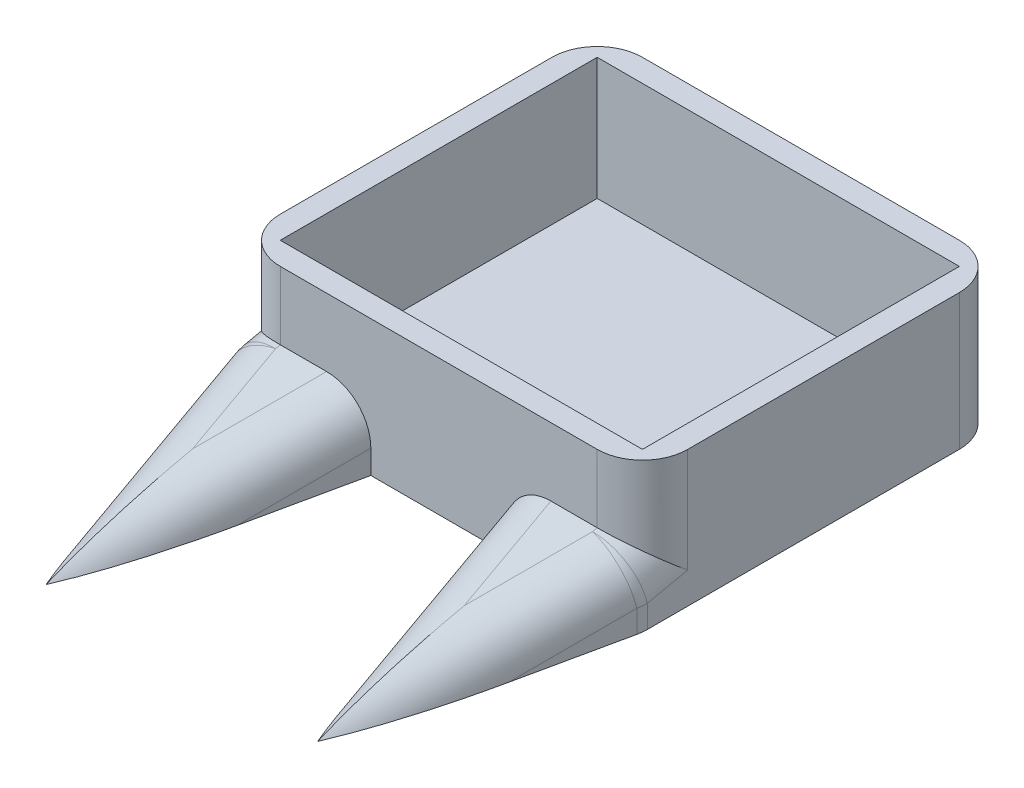
ISO-10303-21;
HEADER;
FILE_DESCRIPTION(('STEP AP214'),'2;1');
FILE_NAME('part.step','',(''),(''),'','','');
FILE_SCHEMA(('AUTOMOTIVE_DESIGN { 1 0 10303 214 1 1 1 1 }'));
ENDSEC;
DATA;
#1=APPLICATION_CONTEXT('core data for automotive mechanical design processes');
#2=APPLICATION_PROTOCOL_DEFINITION('international standard','automotive_design',2000,#1);
#3=PRODUCT_CONTEXT('',#1,'mechanical');
#4=PRODUCT('Part','Part','',(#3));
#5=PRODUCT_RELATED_PRODUCT_CATEGORY('part','',(#4));
#6=PRODUCT_DEFINITION_FORMATION('','',#4);
#7=PRODUCT_DEFINITION_CONTEXT('part definition',#1,'design');
#8=PRODUCT_DEFINITION('design','',#6,#7);
#9=PRODUCT_DEFINITION_SHAPE('','',#8);
#10=(LENGTH_UNIT() NAMED_UNIT(*) SI_UNIT(.MILLI.,.METRE.));
#11=(NAMED_UNIT(*) PLANE_ANGLE_UNIT() SI_UNIT($,.RADIAN.));
#12=(NAMED_UNIT(*) SI_UNIT($,.STERADIAN.) SOLID_ANGLE_UNIT());
#13=UNCERTAINTY_MEASURE_WITH_UNIT(LENGTH_MEASURE(1.E-05),#10,'distance_accuracy_value','');
#14=(GEOMETRIC_REPRESENTATION_CONTEXT(3) GLOBAL_UNCERTAINTY_ASSIGNED_CONTEXT((#13)) GLOBAL_UNIT_ASSIGNED_CONTEXT((#10,
#11,#12)) REPRESENTATION_CONTEXT('',''));
#15=CARTESIAN_POINT('',(0.,0.,0.));
#16=DIRECTION('',(0.,0.,1.));
#17=DIRECTION('',(1.,0.,0.));
#18=AXIS2_PLACEMENT_3D('',#15,#16,#17);
#19=CARTESIAN_POINT('',(0.,30.,0.));
#20=DIRECTION('',(0.,1.,0.));
#21=DIRECTION('',(0.,0.,1.));
#22=AXIS2_PLACEMENT_3D('',#19,#20,#21);
#23=PLANE('',#22);
#24=DIRECTION('',(0.,0.,-1.));
#25=VECTOR('',#24,1.);
#26=CARTESIAN_POINT('',(40.,30.,-35.));
#27=LINE('',#26,#25);
#28=CARTESIAN_POINT('',(40.,30.,35.));
#29=VERTEX_POINT('',#28);
#30=CARTESIAN_POINT('',(40.,30.,-35.));
#31=VERTEX_POINT('',#30);
#32=EDGE_CURVE('E237',#29,#31,#27,.T.);
#33=ORIENTED_EDGE('',*,*,#32,.F.);
#34=DIRECTION('',(1.,0.,0.));
#35=VECTOR('',#34,1.);
#36=CARTESIAN_POINT('',(-40.,30.,35.));
#37=LINE('',#36,#35);
#38=CARTESIAN_POINT('',(-40.,30.,35.));
#39=VERTEX_POINT('',#38);
#40=EDGE_CURVE('E251',#39,#29,#37,.T.);
#41=ORIENTED_EDGE('',*,*,#40,.F.);
#42=DIRECTION('',(0.,0.,1.));
#43=VECTOR('',#42,1.);
#44=CARTESIAN_POINT('',(-40.,30.,-35.));
#45=LINE('',#44,#43);
#46=CARTESIAN_POINT('',(-40.,30.,-35.));
#47=VERTEX_POINT('',#46);
#48=EDGE_CURVE('E258',#47,#39,#45,.T.);
#49=ORIENTED_EDGE('',*,*,#48,.F.);
#50=DIRECTION('',(-1.,0.,0.));
#51=VECTOR('',#50,1.);
#52=CARTESIAN_POINT('',(-40.,30.,-35.));
#53=LINE('',#52,#51);
#54=EDGE_CURVE('E265',#31,#47,#53,.T.);
#55=ORIENTED_EDGE('',*,*,#54,.F.);
#56=EDGE_LOOP('',(#33,#41,#49,#55));
#57=FACE_BOUND('',#56,.T.);
#58=DIRECTION('',(0.,0.,-1.));
#59=VECTOR('',#58,1.);
#60=CARTESIAN_POINT('',(-45.,30.,40.));
#61=LINE('',#60,#59);
#62=CARTESIAN_POINT('',(-45.,30.,30.));
#63=VERTEX_POINT('',#62);
#64=CARTESIAN_POINT('',(-45.,30.,-30.));
#65=VERTEX_POINT('',#64);
#66=EDGE_CURVE('E292',#63,#65,#61,.T.);
#67=ORIENTED_EDGE('',*,*,#66,.F.);
#68=CARTESIAN_POINT('',(-35.,30.,30.));
#69=DIRECTION('',(0.,1.,0.));
#70=DIRECTION('',(0.,0.,1.));
#71=AXIS2_PLACEMENT_3D('',#68,#69,#70);
#72=CIRCLE('',#71,10.);
#73=CARTESIAN_POINT('',(-35.,30.,40.));
#74=VERTEX_POINT('',#73);
#75=EDGE_CURVE('E400',#63,#74,#72,.T.);
#76=ORIENTED_EDGE('',*,*,#75,.T.);
#77=DIRECTION('',(1.,0.,0.));
#78=VECTOR('',#77,1.);
#79=CARTESIAN_POINT('',(-45.,30.,40.));
#80=LINE('',#79,#78);
#81=CARTESIAN_POINT('',(35.,30.,40.));
#82=VERTEX_POINT('',#81);
#83=EDGE_CURVE('E296',#74,#82,#80,.T.);
#84=ORIENTED_EDGE('',*,*,#83,.T.);
#85=CARTESIAN_POINT('',(35.,30.,30.));
#86=DIRECTION('',(0.,1.,0.));
#87=DIRECTION('',(0.,0.,1.));
#88=AXIS2_PLACEMENT_3D('',#85,#86,#87);
#89=CIRCLE('',#88,10.);
#90=CARTESIAN_POINT('',(45.,30.,30.));
#91=VERTEX_POINT('',#90);
#92=EDGE_CURVE('E399',#82,#91,#89,.T.);
#93=ORIENTED_EDGE('',*,*,#92,.T.);
#94=DIRECTION('',(0.,0.,-1.));
#95=VECTOR('',#94,1.);
#96=CARTESIAN_POINT('',(45.,30.,40.));
#97=LINE('',#96,#95);
#98=CARTESIAN_POINT('',(45.,30.,-30.));
#99=VERTEX_POINT('',#98);
#100=EDGE_CURVE('E300',#91,#99,#97,.T.);
#101=ORIENTED_EDGE('',*,*,#100,.T.);
#102=CARTESIAN_POINT('',(35.,30.,-30.));
#103=DIRECTION('',(0.,1.,0.));
#104=DIRECTION('',(0.,0.,1.));
#105=AXIS2_PLACEMENT_3D('',#102,#103,#104);
#106=CIRCLE('',#105,10.);
#107=CARTESIAN_POINT('',(35.,30.,-40.));
#108=VERTEX_POINT('',#107);
#109=EDGE_CURVE('E84',#99,#108,#106,.T.);
#110=ORIENTED_EDGE('',*,*,#109,.T.);
#111=DIRECTION('',(1.,0.,0.));
#112=VECTOR('',#111,1.);
#113=CARTESIAN_POINT('',(-45.,30.,-40.));
#114=LINE('',#113,#112);
#115=CARTESIAN_POINT('',(-35.,30.,-40.));
#116=VERTEX_POINT('',#115);
#117=EDGE_CURVE('E293',#116,#108,#114,.T.);
#118=ORIENTED_EDGE('',*,*,#117,.F.);
#119=CARTESIAN_POINT('',(-35.,30.,-30.));
#120=DIRECTION('',(0.,1.,0.));
#121=DIRECTION('',(0.,0.,1.));
#122=AXIS2_PLACEMENT_3D('',#119,#120,#121);
#123=CIRCLE('',#122,10.);
#124=EDGE_CURVE('E396',#116,#65,#123,.T.);
#125=ORIENTED_EDGE('',*,*,#124,.T.);
#126=EDGE_LOOP('',(#67,#76,#84,#93,#101,#110,#118,#125));
#127=FACE_BOUND('',#126,.T.);
#128=ADVANCED_FACE('F66',(#57,#127),#23,.T.);
#129=CARTESIAN_POINT('',(15.,30.,40.));
#130=DIRECTION('',(0.977802414077409,0.,-0.209529088730874));
#131=DIRECTION('',(-0.209529088730874,0.,-0.977802414077409));
#132=AXIS2_PLACEMENT_3D('',#129,#130,#131);
#133=PLANE('',#132);
#134=DIRECTION('',(0.209529088730874,0.,0.977802414077409));
#135=VECTOR('',#134,1.);
#136=CARTESIAN_POINT('',(15.,0.,40.));
#137=LINE('',#136,#135);
#138=CARTESIAN_POINT('',(15.,0.,40.));
#139=VERTEX_POINT('',#138);
#140=CARTESIAN_POINT('',(20.2219758592259,0.,64.3692206763876));
#141=VERTEX_POINT('',#140);
#142=EDGE_CURVE('E282',#139,#141,#137,.T.);
#143=ORIENTED_EDGE('',*,*,#142,.T.);
#144=DIRECTION('',(-0.2050757781074,0.205075778107399,-0.957020297834528));
#145=VECTOR('',#144,1.);
#146=CARTESIAN_POINT('',(13.957933564173,6.26404229505286,35.1370232994742));
#147=LINE('',#146,#145);
#148=CARTESIAN_POINT('',(15.,5.22197585922591,40.));
#149=VERTEX_POINT('',#148);
#150=EDGE_CURVE('E331',#141,#149,#147,.T.);
#151=ORIENTED_EDGE('',*,*,#150,.T.);
#152=DIRECTION('',(0.,-1.,0.));
#153=VECTOR('',#152,1.);
#154=CARTESIAN_POINT('',(15.,30.,40.));
#155=LINE('',#154,#153);
#156=EDGE_CURVE('E281',#149,#139,#155,.T.);
#157=ORIENTED_EDGE('',*,*,#156,.T.);
#158=EDGE_LOOP('',(#143,#151,#157));
#159=FACE_BOUND('',#158,.T.);
#160=ADVANCED_FACE('F516',(#159),#133,.F.);
#161=CARTESIAN_POINT('',(45.,30.,40.));
#162=DIRECTION('',(0.977802414077409,0.,0.209529088730873));
#163=DIRECTION('',(0.209529088730873,0.,-0.97780241407741));
#164=AXIS2_PLACEMENT_3D('',#161,#162,#163);
#165=PLANE('',#164);
#166=DIRECTION('',(-0.209529088730873,0.,0.97780241407741));
#167=VECTOR('',#166,1.);
#168=CARTESIAN_POINT('',(45.,0.,40.));
#169=LINE('',#168,#167);
#170=CARTESIAN_POINT('',(44.7780241407741,0.,41.0358873430542));
#171=VERTEX_POINT('',#170);
#172=CARTESIAN_POINT('',(39.7780241407741,0.,64.3692206763876));
#173=VERTEX_POINT('',#172);
#174=EDGE_CURVE('E279',#171,#173,#169,.T.);
#175=ORIENTED_EDGE('',*,*,#174,.F.);
#176=DIRECTION('',(0.,-1.,0.));
#177=VECTOR('',#176,1.);
#178=CARTESIAN_POINT('',(44.7780241407741,5.22197585922591,41.0358873430542));
#179=LINE('',#178,#177);
#180=CARTESIAN_POINT('',(44.7780241407741,5.00000000000001,41.0358873430542));
#181=VERTEX_POINT('',#180);
#182=EDGE_CURVE('E384',#171,#181,#179,.F.);
#183=ORIENTED_EDGE('',*,*,#182,.T.);
#184=DIRECTION('',(0.205075778107399,0.205075778107399,-0.957020297834529));
#185=VECTOR('',#184,1.);
#186=CARTESIAN_POINT('',(30.4112253143316,-9.36679882644248,108.080948533119));
#187=LINE('',#186,#185);
#188=EDGE_CURVE('E342',#181,#173,#187,.F.);
#189=ORIENTED_EDGE('',*,*,#188,.T.);
#190=EDGE_LOOP('',(#175,#183,#189));
#191=FACE_BOUND('',#190,.T.);
#192=ADVANCED_FACE('F514',(#191),#165,.T.);
#193=CARTESIAN_POINT('',(0.,0.,0.));
#194=DIRECTION('',(0.,1.,0.));
#195=DIRECTION('',(0.,0.,1.));
#196=AXIS2_PLACEMENT_3D('',#193,#194,#195);
#197=PLANE('',#196);
#198=DIRECTION('',(0.209529088730874,0.,0.97780241407741));
#199=VECTOR('',#198,1.);
#200=CARTESIAN_POINT('',(-45.,0.,40.));
#201=LINE('',#200,#199);
#202=CARTESIAN_POINT('',(-44.7780241407741,0.,41.0358873430542));
#203=VERTEX_POINT('',#202);
#204=CARTESIAN_POINT('',(-39.7780241407741,0.,64.3692206763876));
#205=VERTEX_POINT('',#204);
#206=EDGE_CURVE('E289',#203,#205,#201,.T.);
#207=ORIENTED_EDGE('',*,*,#206,.F.);
#208=CARTESIAN_POINT('',(-35.,0.,38.9405964557455));
#209=DIRECTION('',(0.,1.,0.));
#210=DIRECTION('',(0.,0.,1.));
#211=AXIS2_PLACEMENT_3D('',#208,#209,#210);
#212=CIRCLE('',#211,10.);
#213=CARTESIAN_POINT('',(-45.,0.,38.9405964557455));
#214=VERTEX_POINT('',#213);
#215=EDGE_CURVE('E364',#203,#214,#212,.F.);
#216=ORIENTED_EDGE('',*,*,#215,.T.);
#217=DIRECTION('',(0.,0.,-1.));
#218=VECTOR('',#217,1.);
#219=CARTESIAN_POINT('',(-45.,0.,40.));
#220=LINE('',#219,#218);
#221=CARTESIAN_POINT('',(-45.,0.,-30.));
#222=VERTEX_POINT('',#221);
#223=EDGE_CURVE('E298',#214,#222,#220,.T.);
#224=ORIENTED_EDGE('',*,*,#223,.T.);
#225=CARTESIAN_POINT('',(-35.,0.,-30.));
#226=DIRECTION('',(0.,1.,0.));
#227=DIRECTION('',(0.,0.,1.));
#228=AXIS2_PLACEMENT_3D('',#225,#226,#227);
#229=CIRCLE('',#228,10.);
#230=CARTESIAN_POINT('',(-35.,0.,-40.));
#231=VERTEX_POINT('',#230);
#232=EDGE_CURVE('E363',#222,#231,#229,.F.);
#233=ORIENTED_EDGE('',*,*,#232,.T.);
#234=DIRECTION('',(1.,0.,0.));
#235=VECTOR('',#234,1.);
#236=CARTESIAN_POINT('',(-45.,0.,-40.));
#237=LINE('',#236,#235);
#238=CARTESIAN_POINT('',(35.,0.,-40.));
#239=VERTEX_POINT('',#238);
#240=EDGE_CURVE('E305',#231,#239,#237,.T.);
#241=ORIENTED_EDGE('',*,*,#240,.T.);
#242=CARTESIAN_POINT('',(35.,0.,-30.));
#243=DIRECTION('',(0.,1.,0.));
#244=DIRECTION('',(0.,0.,1.));
#245=AXIS2_PLACEMENT_3D('',#242,#243,#244);
#246=CIRCLE('',#245,10.);
#247=CARTESIAN_POINT('',(45.,0.,-30.));
#248=VERTEX_POINT('',#247);
#249=EDGE_CURVE('E358',#239,#248,#246,.F.);
#250=ORIENTED_EDGE('',*,*,#249,.T.);
#251=DIRECTION('',(0.,0.,-1.));
#252=VECTOR('',#251,1.);
#253=CARTESIAN_POINT('',(45.,0.,40.));
#254=LINE('',#253,#252);
#255=CARTESIAN_POINT('',(45.,0.,38.9405964557455));
#256=VERTEX_POINT('',#255);
#257=EDGE_CURVE('E306',#256,#248,#254,.T.);
#258=ORIENTED_EDGE('',*,*,#257,.F.);
#259=CARTESIAN_POINT('',(35.,0.,38.9405964557455));
#260=DIRECTION('',(0.,1.,0.));
#261=DIRECTION('',(0.,0.,1.));
#262=AXIS2_PLACEMENT_3D('',#259,#260,#261);
#263=CIRCLE('',#262,10.);
#264=EDGE_CURVE('E361',#256,#171,#263,.F.);
#265=ORIENTED_EDGE('',*,*,#264,.T.);
#266=ORIENTED_EDGE('',*,*,#174,.T.);
#267=CARTESIAN_POINT('',(30.,0.,62.2739297890788));
#268=DIRECTION('',(0.,1.,0.));
#269=DIRECTION('',(-0.209529088730873,0.,0.97780241407741));
#270=AXIS2_PLACEMENT_3D('',#267,#268,#269);
#271=ELLIPSE('',#270,48.762462794426,10.);
#272=CARTESIAN_POINT('',(30.,0.,96.7541978983742));
#273=VERTEX_POINT('',#272);
#274=EDGE_CURVE('E323',#173,#273,#271,.F.);
#275=ORIENTED_EDGE('',*,*,#274,.T.);
#276=CARTESIAN_POINT('',(30.,0.,62.2739297890788));
#277=DIRECTION('',(0.,1.,0.));
#278=DIRECTION('',(-0.209529088730874,0.,-0.977802414077409));
#279=AXIS2_PLACEMENT_3D('',#276,#277,#278);
#280=ELLIPSE('',#279,48.762462794426,10.);
#281=EDGE_CURVE('E324',#273,#141,#280,.F.);
#282=ORIENTED_EDGE('',*,*,#281,.T.);
#283=ORIENTED_EDGE('',*,*,#142,.F.);
#284=DIRECTION('',(1.,0.,0.));
#285=VECTOR('',#284,1.);
#286=CARTESIAN_POINT('',(-45.,0.,40.));
#287=LINE('',#286,#285);
#288=CARTESIAN_POINT('',(-15.,0.,40.));
#289=VERTEX_POINT('',#288);
#290=EDGE_CURVE('E313',#289,#139,#287,.T.);
#291=ORIENTED_EDGE('',*,*,#290,.F.);
#292=DIRECTION('',(-0.209529088730874,0.,0.97780241407741));
#293=VECTOR('',#292,1.);
#294=CARTESIAN_POINT('',(-15.,0.,40.));
#295=LINE('',#294,#293);
#296=CARTESIAN_POINT('',(-20.2219758592259,0.,64.3692206763875));
#297=VERTEX_POINT('',#296);
#298=EDGE_CURVE('E290',#289,#297,#295,.T.);
#299=ORIENTED_EDGE('',*,*,#298,.T.);
#300=CARTESIAN_POINT('',(-30.,0.,62.2739297890788));
#301=DIRECTION('',(0.,1.,0.));
#302=DIRECTION('',(-0.209529088730874,0.,0.97780241407741));
#303=AXIS2_PLACEMENT_3D('',#300,#301,#302);
#304=ELLIPSE('',#303,48.762462794426,10.);
#305=CARTESIAN_POINT('',(-30.,0.,96.7541978983741));
#306=VERTEX_POINT('',#305);
#307=EDGE_CURVE('E330',#297,#306,#304,.F.);
#308=ORIENTED_EDGE('',*,*,#307,.T.);
#309=CARTESIAN_POINT('',(-30.,0.,62.2739297890788));
#310=DIRECTION('',(0.,1.,0.));
#311=DIRECTION('',(-0.209529088730874,0.,-0.977802414077409));
#312=AXIS2_PLACEMENT_3D('',#309,#310,#311);
#313=ELLIPSE('',#312,48.762462794426,10.);
#314=EDGE_CURVE('E328',#306,#205,#313,.F.);
#315=ORIENTED_EDGE('',*,*,#314,.T.);
#316=EDGE_LOOP('',(#207,#216,#224,#233,#241,#250,#258,#265,#266,#275,#282,#283,#291,#299,#308,#315));
#317=FACE_BOUND('',#316,.T.);
#318=ADVANCED_FACE('F455',(#317),#197,.F.);
#319=CARTESIAN_POINT('',(-45.,30.,40.));
#320=DIRECTION('',(0.97780241407741,0.,-0.209529088730874));
#321=DIRECTION('',(-0.209529088730874,0.,-0.97780241407741));
#322=AXIS2_PLACEMENT_3D('',#319,#320,#321);
#323=PLANE('',#322);
#324=DIRECTION('',(-0.205075778107399,0.205075778107399,-0.957020297834528));
#325=VECTOR('',#324,1.);
#326=CARTESIAN_POINT('',(-46.0420664358269,6.26404229505286,35.1370232994742));
#327=LINE('',#326,#325);
#328=CARTESIAN_POINT('',(-44.7780241407741,5.00000000000001,41.0358873430542));
#329=VERTEX_POINT('',#328);
#330=EDGE_CURVE('E287',#205,#329,#327,.T.);
#331=ORIENTED_EDGE('',*,*,#330,.T.);
#332=DIRECTION('',(0.,-1.,0.));
#333=VECTOR('',#332,1.);
#334=CARTESIAN_POINT('',(-44.7780241407741,0.,41.0358873430542));
#335=LINE('',#334,#333);
#336=EDGE_CURVE('E357',#329,#203,#335,.T.);
#337=ORIENTED_EDGE('',*,*,#336,.T.);
#338=ORIENTED_EDGE('',*,*,#206,.T.);
#339=EDGE_LOOP('',(#331,#337,#338));
#340=FACE_BOUND('',#339,.T.);
#341=ADVANCED_FACE('F501',(#340),#323,.F.);
#342=CARTESIAN_POINT('',(-15.,30.,40.));
#343=DIRECTION('',(0.97780241407741,0.,0.209529088730874));
#344=DIRECTION('',(0.209529088730874,0.,-0.97780241407741));
#345=AXIS2_PLACEMENT_3D('',#342,#343,#344);
#346=PLANE('',#345);
#347=DIRECTION('',(0.,-1.,0.));
#348=VECTOR('',#347,1.);
#349=CARTESIAN_POINT('',(-15.,30.,40.));
#350=LINE('',#349,#348);
#351=CARTESIAN_POINT('',(-15.,5.22197585922591,40.));
#352=VERTEX_POINT('',#351);
#353=EDGE_CURVE('E285',#352,#289,#350,.T.);
#354=ORIENTED_EDGE('',*,*,#353,.F.);
#355=DIRECTION('',(0.205075778107399,0.205075778107399,-0.957020297834528));
#356=VECTOR('',#355,1.);
#357=CARTESIAN_POINT('',(-29.5887746856683,-9.36679882644247,108.080948533119));
#358=LINE('',#357,#356);
#359=EDGE_CURVE('E335',#352,#297,#358,.F.);
#360=ORIENTED_EDGE('',*,*,#359,.T.);
#361=ORIENTED_EDGE('',*,*,#298,.F.);
#362=EDGE_LOOP('',(#354,#360,#361));
#363=FACE_BOUND('',#362,.T.);
#364=ADVANCED_FACE('F486',(#363),#346,.T.);
#365=CARTESIAN_POINT('',(-45.,30.,40.));
#366=DIRECTION('',(-1.,0.,0.));
#367=DIRECTION('',(0.,0.,1.));
#368=AXIS2_PLACEMENT_3D('',#365,#366,#367);
#369=PLANE('',#368);
#370=ORIENTED_EDGE('',*,*,#223,.F.);
#371=DIRECTION('',(0.,-1.,0.));
#372=VECTOR('',#371,1.);
#373=CARTESIAN_POINT('',(-45.,5.22197585922591,38.9405964557455));
#374=LINE('',#373,#372);
#375=CARTESIAN_POINT('',(-45.,5.,38.9405964557455));
#376=VERTEX_POINT('',#375);
#377=EDGE_CURVE('E372',#214,#376,#374,.F.);
#378=ORIENTED_EDGE('',*,*,#377,.T.);
#379=DIRECTION('',(0.,-0.209529088730874,0.97780241407741));
#380=VECTOR('',#379,1.);
#381=CARTESIAN_POINT('',(-45.,4.79269675060655,39.9080116195816));
#382=LINE('',#381,#380);
#383=CARTESIAN_POINT('',(-45.,6.91584209765975,30.));
#384=VERTEX_POINT('',#383);
#385=EDGE_CURVE('E375',#376,#384,#382,.F.);
#386=ORIENTED_EDGE('',*,*,#385,.T.);
#387=DIRECTION('',(0.,-1.,0.));
#388=VECTOR('',#387,1.);
#389=CARTESIAN_POINT('',(-45.,30.,30.));
#390=LINE('',#389,#388);
#391=EDGE_CURVE('E367',#384,#63,#390,.F.);
#392=ORIENTED_EDGE('',*,*,#391,.T.);
#393=ORIENTED_EDGE('',*,*,#66,.T.);
#394=DIRECTION('',(0.,-1.,0.));
#395=VECTOR('',#394,1.);
#396=CARTESIAN_POINT('',(-45.,30.,-30.));
#397=LINE('',#396,#395);
#398=EDGE_CURVE('E370',#65,#222,#397,.T.);
#399=ORIENTED_EDGE('',*,*,#398,.T.);
#400=EDGE_LOOP('',(#370,#378,#386,#392,#393,#399));
#401=FACE_BOUND('',#400,.T.);
#402=ADVANCED_FACE('F465',(#401),#369,.T.);
#403=CARTESIAN_POINT('',(-45.,30.,40.));
#404=DIRECTION('',(0.,0.,-1.));
#405=DIRECTION('',(-1.,0.,0.));
#406=AXIS2_PLACEMENT_3D('',#403,#404,#405);
#407=PLANE('',#406);
#408=ORIENTED_EDGE('',*,*,#83,.F.);
#409=DIRECTION('',(0.,-1.,0.));
#410=VECTOR('',#409,1.);
#411=CARTESIAN_POINT('',(-35.,5.22197585922591,40.));
#412=LINE('',#411,#410);
#413=CARTESIAN_POINT('',(-35.,15.,40.));
#414=VERTEX_POINT('',#413);
#415=EDGE_CURVE('E393',#74,#414,#412,.T.);
#416=ORIENTED_EDGE('',*,*,#415,.T.);
#417=DIRECTION('',(1.,0.,0.));
#418=VECTOR('',#417,1.);
#419=CARTESIAN_POINT('',(-56.,15.,40.));
#420=LINE('',#419,#418);
#421=CARTESIAN_POINT('',(-24.7780241407741,15.,40.));
#422=VERTEX_POINT('',#421);
#423=EDGE_CURVE('E277',#414,#422,#420,.T.);
#424=ORIENTED_EDGE('',*,*,#423,.T.);
#425=CARTESIAN_POINT('',(-25.2270150451974,4.7729849548026,40.));
#426=DIRECTION('',(0.,0.,-1.));
#427=DIRECTION('',(-0.707106781186548,-0.707106781186547,0.));
#428=AXIS2_PLACEMENT_3D('',#425,#426,#427);
#429=ELLIPSE('',#428,10.4490991702341,10.);
#430=EDGE_CURVE('E343',#422,#352,#429,.T.);
#431=ORIENTED_EDGE('',*,*,#430,.T.);
#432=ORIENTED_EDGE('',*,*,#353,.T.);
#433=ORIENTED_EDGE('',*,*,#290,.T.);
#434=ORIENTED_EDGE('',*,*,#156,.F.);
#435=CARTESIAN_POINT('',(25.2270150451974,4.77298495480261,40.));
#436=DIRECTION('',(0.,0.,-1.));
#437=DIRECTION('',(-0.707106781186549,0.707106781186546,0.));
#438=AXIS2_PLACEMENT_3D('',#435,#436,#437);
#439=ELLIPSE('',#438,10.4490991702341,10.);
#440=CARTESIAN_POINT('',(24.7780241407741,15.,40.));
#441=VERTEX_POINT('',#440);
#442=EDGE_CURVE('E347',#149,#441,#439,.T.);
#443=ORIENTED_EDGE('',*,*,#442,.T.);
#444=CARTESIAN_POINT('',(35.,15.,40.));
#445=VERTEX_POINT('',#444);
#446=EDGE_CURVE('E272',#441,#445,#420,.T.);
#447=ORIENTED_EDGE('',*,*,#446,.T.);
#448=DIRECTION('',(0.,-1.,0.));
#449=VECTOR('',#448,1.);
#450=CARTESIAN_POINT('',(35.,30.,40.));
#451=LINE('',#450,#449);
#452=EDGE_CURVE('E392',#445,#82,#451,.F.);
#453=ORIENTED_EDGE('',*,*,#452,.T.);
#454=EDGE_LOOP('',(#408,#416,#424,#431,#432,#433,#434,#443,#447,#453));
#455=FACE_BOUND('',#454,.T.);
#456=ADVANCED_FACE('F444',(#455),#407,.F.);
#457=CARTESIAN_POINT('',(45.,30.,40.));
#458=DIRECTION('',(-1.,0.,0.));
#459=DIRECTION('',(0.,0.,1.));
#460=AXIS2_PLACEMENT_3D('',#457,#458,#459);
#461=PLANE('',#460);
#462=DIRECTION('',(0.,-0.209529088730874,0.97780241407741));
#463=VECTOR('',#462,1.);
#464=CARTESIAN_POINT('',(45.,5.88051244459175,34.8315383809839));
#465=LINE('',#464,#463);
#466=CARTESIAN_POINT('',(45.,6.91584209765974,30.));
#467=VERTEX_POINT('',#466);
#468=CARTESIAN_POINT('',(45.,4.99999999999999,38.9405964557455));
#469=VERTEX_POINT('',#468);
#470=EDGE_CURVE('E379',#467,#469,#465,.T.);
#471=ORIENTED_EDGE('',*,*,#470,.T.);
#472=DIRECTION('',(0.,-1.,0.));
#473=VECTOR('',#472,1.);
#474=CARTESIAN_POINT('',(45.,0.,38.9405964557455));
#475=LINE('',#474,#473);
#476=EDGE_CURVE('E382',#469,#256,#475,.T.);
#477=ORIENTED_EDGE('',*,*,#476,.T.);
#478=ORIENTED_EDGE('',*,*,#257,.T.);
#479=DIRECTION('',(0.,-1.,0.));
#480=VECTOR('',#479,1.);
#481=CARTESIAN_POINT('',(45.,30.,-30.));
#482=LINE('',#481,#480);
#483=EDGE_CURVE('E376',#248,#99,#482,.F.);
#484=ORIENTED_EDGE('',*,*,#483,.T.);
#485=ORIENTED_EDGE('',*,*,#100,.F.);
#486=DIRECTION('',(0.,-1.,0.));
#487=VECTOR('',#486,1.);
#488=CARTESIAN_POINT('',(45.,30.,30.));
#489=LINE('',#488,#487);
#490=EDGE_CURVE('E378',#91,#467,#489,.T.);
#491=ORIENTED_EDGE('',*,*,#490,.T.);
#492=EDGE_LOOP('',(#471,#477,#478,#484,#485,#491));
#493=FACE_BOUND('',#492,.T.);
#494=ADVANCED_FACE('F431',(#493),#461,.F.);
#495=CARTESIAN_POINT('',(-45.,30.,-40.));
#496=DIRECTION('',(0.,0.,-1.));
#497=DIRECTION('',(-1.,0.,0.));
#498=AXIS2_PLACEMENT_3D('',#495,#496,#497);
#499=PLANE('',#498);
#500=ORIENTED_EDGE('',*,*,#240,.F.);
#501=DIRECTION('',(0.,-1.,0.));
#502=VECTOR('',#501,1.);
#503=CARTESIAN_POINT('',(-35.,30.,-40.));
#504=LINE('',#503,#502);
#505=EDGE_CURVE('E12',#231,#116,#504,.F.);
#506=ORIENTED_EDGE('',*,*,#505,.T.);
#507=ORIENTED_EDGE('',*,*,#117,.T.);
#508=DIRECTION('',(0.,-1.,0.));
#509=VECTOR('',#508,1.);
#510=CARTESIAN_POINT('',(35.,0.,-40.));
#511=LINE('',#510,#509);
#512=EDGE_CURVE('E73',#108,#239,#511,.T.);
#513=ORIENTED_EDGE('',*,*,#512,.T.);
#514=EDGE_LOOP('',(#500,#506,#507,#513));
#515=FACE_BOUND('',#514,.T.);
#516=ADVANCED_FACE('F452',(#515),#499,.T.);
#517=CARTESIAN_POINT('',(-56.,0.,110.));
#518=DIRECTION('',(0.,-0.97780241407741,-0.209529088730874));
#519=DIRECTION('',(0.,0.209529088730874,-0.97780241407741));
#520=AXIS2_PLACEMENT_3D('',#517,#518,#519);
#521=PLANE('',#520);
#522=DIRECTION('',(0.205075778107399,0.205075778107399,-0.957020297834529));
#523=VECTOR('',#522,1.);
#524=CARTESIAN_POINT('',(35.6332011735575,15.4112253143316,38.0809485331191));
#525=LINE('',#524,#523);
#526=CARTESIAN_POINT('',(30.,9.77802414077409,64.3692206763876));
#527=VERTEX_POINT('',#526);
#528=CARTESIAN_POINT('',(35.,14.7780241407741,41.0358873430542));
#529=VERTEX_POINT('',#528);
#530=EDGE_CURVE('E340',#527,#529,#525,.T.);
#531=ORIENTED_EDGE('',*,*,#530,.T.);
#532=DIRECTION('',(0.,-0.209529088730874,0.97780241407741));
#533=VECTOR('',#532,1.);
#534=CARTESIAN_POINT('',(35.,0.,110.));
#535=LINE('',#534,#533);
#536=EDGE_CURVE('E386',#529,#445,#535,.F.);
#537=ORIENTED_EDGE('',*,*,#536,.T.);
#538=ORIENTED_EDGE('',*,*,#446,.F.);
#539=DIRECTION('',(-0.2050757781074,0.205075778107399,-0.957020297834528));
#540=VECTOR('',#539,1.);
#541=CARTESIAN_POINT('',(35.7499763965359,4.02804774423818,91.2024438602218));
#542=LINE('',#541,#540);
#543=EDGE_CURVE('E336',#441,#527,#542,.F.);
#544=ORIENTED_EDGE('',*,*,#543,.T.);
#545=EDGE_LOOP('',(#531,#537,#538,#544));
#546=FACE_BOUND('',#545,.T.);
#547=ADVANCED_FACE('F440',(#546),#521,.F.);
#548=ORIENTED_EDGE('',*,*,#423,.F.);
#549=DIRECTION('',(0.,-0.209529088730874,0.97780241407741));
#550=VECTOR('',#549,1.);
#551=CARTESIAN_POINT('',(-35.,14.3414634146341,43.0731707317073));
#552=LINE('',#551,#550);
#553=CARTESIAN_POINT('',(-35.,14.7780241407741,41.0358873430542));
#554=VERTEX_POINT('',#553);
#555=EDGE_CURVE('E346',#414,#554,#552,.T.);
#556=ORIENTED_EDGE('',*,*,#555,.T.);
#557=DIRECTION('',(-0.205075778107399,0.205075778107399,-0.957020297834528));
#558=VECTOR('',#557,1.);
#559=CARTESIAN_POINT('',(-21.7266591174827,1.50468325825686,102.978144794801));
#560=LINE('',#559,#558);
#561=CARTESIAN_POINT('',(-30.,9.77802414077408,64.3692206763876));
#562=VERTEX_POINT('',#561);
#563=EDGE_CURVE('E321',#554,#562,#560,.F.);
#564=ORIENTED_EDGE('',*,*,#563,.T.);
#565=DIRECTION('',(0.205075778107399,0.205075778107399,-0.957020297834528));
#566=VECTOR('',#565,1.);
#567=CARTESIAN_POINT('',(-24.3667988264424,15.4112253143316,38.0809485331191));
#568=LINE('',#567,#566);
#569=EDGE_CURVE('E318',#562,#422,#568,.T.);
#570=ORIENTED_EDGE('',*,*,#569,.T.);
#571=EDGE_LOOP('',(#548,#556,#564,#570));
#572=FACE_BOUND('',#571,.T.);
#573=ADVANCED_FACE('F471',(#572),#521,.F.);
#574=CARTESIAN_POINT('',(-40.4602567703677,-10.4602567703677,111.088461384128));
#575=DIRECTION('',(-0.205075778107399,-0.205075778107399,0.957020297834529));
#576=DIRECTION('',(0.977802414077409,0.,0.209529088730874));
#577=AXIS2_PLACEMENT_3D('',#574,#575,#576);
#578=CYLINDRICAL_SURFACE('',#577,10.);
#579=ORIENTED_EDGE('',*,*,#430,.F.);
#580=ORIENTED_EDGE('',*,*,#569,.F.);
#581=CARTESIAN_POINT('',(-30.,0.,62.2739297890788));
#582=DIRECTION('',(-1.,0.,0.));
#583=DIRECTION('',(0.,-0.209529088730873,0.977802414077409));
#584=AXIS2_PLACEMENT_3D('',#581,#582,#583);
#585=ELLIPSE('',#584,48.7624627944259,10.);
#586=EDGE_CURVE('E280',#306,#562,#585,.T.);
#587=ORIENTED_EDGE('',*,*,#586,.F.);
#588=ORIENTED_EDGE('',*,*,#307,.F.);
#589=ORIENTED_EDGE('',*,*,#359,.F.);
#590=EDGE_LOOP('',(#579,#580,#587,#588,#589));
#591=FACE_BOUND('',#590,.T.);
#592=ADVANCED_FACE('F477',(#591),#578,.T.);
#593=CARTESIAN_POINT('',(-36.2640422950528,6.26404229505286,33.0417324121655));
#594=DIRECTION('',(-0.205075778107399,0.205075778107399,-0.957020297834528));
#595=DIRECTION('',(-0.977802414077409,0.,0.209529088730874));
#596=AXIS2_PLACEMENT_3D('',#593,#594,#595);
#597=CYLINDRICAL_SURFACE('',#596,10.);
#598=ORIENTED_EDGE('',*,*,#563,.F.);
#599=CARTESIAN_POINT('',(-35.,5.,38.9405964557455));
#600=DIRECTION('',(-0.205075778107399,0.205075778107399,-0.957020297834528));
#601=DIRECTION('',(-0.977802414077409,0.,0.209529088730874));
#602=AXIS2_PLACEMENT_3D('',#599,#600,#601);
#603=CIRCLE('',#602,10.);
#604=EDGE_CURVE('E351',#554,#329,#603,.F.);
#605=ORIENTED_EDGE('',*,*,#604,.T.);
#606=ORIENTED_EDGE('',*,*,#330,.F.);
#607=ORIENTED_EDGE('',*,*,#314,.F.);
#608=ORIENTED_EDGE('',*,*,#586,.T.);
#609=EDGE_LOOP('',(#598,#605,#606,#607,#608));
#610=FACE_BOUND('',#609,.T.);
#611=ADVANCED_FACE('F491',(#610),#597,.T.);
#612=CARTESIAN_POINT('',(17.016378743651,-12.983621256349,122.864162318708));
#613=DIRECTION('',(-0.205075778107399,-0.205075778107399,0.957020297834528));
#614=DIRECTION('',(0.,-0.977802414077409,-0.209529088730873));
#615=AXIS2_PLACEMENT_3D('',#612,#613,#614);
#616=CYLINDRICAL_SURFACE('',#615,10.);
#617=ORIENTED_EDGE('',*,*,#188,.F.);
#618=CARTESIAN_POINT('',(35.,5.,38.9405964557455));
#619=DIRECTION('',(-0.205075778107399,-0.205075778107399,0.957020297834528));
#620=DIRECTION('',(0.,-0.977802414077409,-0.209529088730873));
#621=AXIS2_PLACEMENT_3D('',#618,#619,#620);
#622=CIRCLE('',#621,10.);
#623=EDGE_CURVE('E390',#181,#529,#622,.T.);
#624=ORIENTED_EDGE('',*,*,#623,.T.);
#625=ORIENTED_EDGE('',*,*,#530,.F.);
#626=CARTESIAN_POINT('',(30.,0.,62.2739297890789));
#627=DIRECTION('',(-1.,0.,0.));
#628=DIRECTION('',(0.,-0.209529088730873,0.977802414077409));
#629=AXIS2_PLACEMENT_3D('',#626,#627,#628);
#630=ELLIPSE('',#629,48.7624627944259,10.);
#631=EDGE_CURVE('E267',#273,#527,#630,.T.);
#632=ORIENTED_EDGE('',*,*,#631,.F.);
#633=ORIENTED_EDGE('',*,*,#274,.F.);
#634=EDGE_LOOP('',(#617,#624,#625,#632,#633));
#635=FACE_BOUND('',#634,.T.);
#636=ADVANCED_FACE('F541',(#635),#616,.T.);
#637=CARTESIAN_POINT('',(23.7359577049471,6.26404229505286,33.0417324121655));
#638=DIRECTION('',(-0.2050757781074,0.205075778107399,-0.957020297834528));
#639=DIRECTION('',(-0.977802414077409,0.,0.209529088730874));
#640=AXIS2_PLACEMENT_3D('',#637,#638,#639);
#641=CYLINDRICAL_SURFACE('',#640,10.);
#642=ORIENTED_EDGE('',*,*,#631,.T.);
#643=ORIENTED_EDGE('',*,*,#543,.F.);
#644=ORIENTED_EDGE('',*,*,#442,.F.);
#645=ORIENTED_EDGE('',*,*,#150,.F.);
#646=ORIENTED_EDGE('',*,*,#281,.F.);
#647=EDGE_LOOP('',(#642,#643,#644,#645,#646));
#648=FACE_BOUND('',#647,.T.);
#649=ADVANCED_FACE('F544',(#648),#641,.T.);
#650=CARTESIAN_POINT('',(40.,3.,-35.));
#651=DIRECTION('',(1.,0.,0.));
#652=DIRECTION('',(0.,0.,-1.));
#653=AXIS2_PLACEMENT_3D('',#650,#651,#652);
#654=PLANE('',#653);
#655=ORIENTED_EDGE('',*,*,#32,.T.);
#656=DIRECTION('',(0.,1.,0.));
#657=VECTOR('',#656,1.);
#658=CARTESIAN_POINT('',(40.,3.,-35.));
#659=LINE('',#658,#657);
#660=CARTESIAN_POINT('',(40.,3.,-35.));
#661=VERTEX_POINT('',#660);
#662=EDGE_CURVE('E229',#661,#31,#659,.T.);
#663=ORIENTED_EDGE('',*,*,#662,.F.);
#664=DIRECTION('',(0.,0.,-1.));
#665=VECTOR('',#664,1.);
#666=CARTESIAN_POINT('',(40.,3.,-35.));
#667=LINE('',#666,#665);
#668=CARTESIAN_POINT('',(40.,3.,35.));
#669=VERTEX_POINT('',#668);
#670=EDGE_CURVE('E234',#669,#661,#667,.T.);
#671=ORIENTED_EDGE('',*,*,#670,.F.);
#672=DIRECTION('',(0.,1.,0.));
#673=VECTOR('',#672,1.);
#674=CARTESIAN_POINT('',(40.,3.,35.));
#675=LINE('',#674,#673);
#676=EDGE_CURVE('E270',#669,#29,#675,.T.);
#677=ORIENTED_EDGE('',*,*,#676,.T.);
#678=EDGE_LOOP('',(#655,#663,#671,#677));
#679=FACE_BOUND('',#678,.T.);
#680=ADVANCED_FACE('F231',(#679),#654,.F.);
#681=CARTESIAN_POINT('',(-40.,3.,35.));
#682=DIRECTION('',(0.,0.,1.));
#683=DIRECTION('',(1.,0.,0.));
#684=AXIS2_PLACEMENT_3D('',#681,#682,#683);
#685=PLANE('',#684);
#686=ORIENTED_EDGE('',*,*,#40,.T.);
#687=ORIENTED_EDGE('',*,*,#676,.F.);
#688=DIRECTION('',(1.,0.,0.));
#689=VECTOR('',#688,1.);
#690=CARTESIAN_POINT('',(-40.,3.,35.));
#691=LINE('',#690,#689);
#692=CARTESIAN_POINT('',(-40.,3.,35.));
#693=VERTEX_POINT('',#692);
#694=EDGE_CURVE('E242',#693,#669,#691,.T.);
#695=ORIENTED_EDGE('',*,*,#694,.F.);
#696=DIRECTION('',(0.,1.,0.));
#697=VECTOR('',#696,1.);
#698=CARTESIAN_POINT('',(-40.,3.,35.));
#699=LINE('',#698,#697);
#700=EDGE_CURVE('E269',#693,#39,#699,.T.);
#701=ORIENTED_EDGE('',*,*,#700,.T.);
#702=EDGE_LOOP('',(#686,#687,#695,#701));
#703=FACE_BOUND('',#702,.T.);
#704=ADVANCED_FACE('F555',(#703),#685,.F.);
#705=CARTESIAN_POINT('',(-40.,3.,-35.));
#706=DIRECTION('',(-1.,0.,0.));
#707=DIRECTION('',(0.,0.,1.));
#708=AXIS2_PLACEMENT_3D('',#705,#706,#707);
#709=PLANE('',#708);
#710=ORIENTED_EDGE('',*,*,#48,.T.);
#711=ORIENTED_EDGE('',*,*,#700,.F.);
#712=DIRECTION('',(0.,0.,1.));
#713=VECTOR('',#712,1.);
#714=CARTESIAN_POINT('',(-40.,3.,-35.));
#715=LINE('',#714,#713);
#716=CARTESIAN_POINT('',(-40.,3.,-35.));
#717=VERTEX_POINT('',#716);
#718=EDGE_CURVE('E248',#717,#693,#715,.T.);
#719=ORIENTED_EDGE('',*,*,#718,.F.);
#720=DIRECTION('',(0.,1.,0.));
#721=VECTOR('',#720,1.);
#722=CARTESIAN_POINT('',(-40.,3.,-35.));
#723=LINE('',#722,#721);
#724=EDGE_CURVE('E238',#717,#47,#723,.T.);
#725=ORIENTED_EDGE('',*,*,#724,.T.);
#726=EDGE_LOOP('',(#710,#711,#719,#725));
#727=FACE_BOUND('',#726,.T.);
#728=ADVANCED_FACE('F655',(#727),#709,.F.);
#729=CARTESIAN_POINT('',(-40.,3.,-35.));
#730=DIRECTION('',(0.,0.,-1.));
#731=DIRECTION('',(-1.,0.,0.));
#732=AXIS2_PLACEMENT_3D('',#729,#730,#731);
#733=PLANE('',#732);
#734=ORIENTED_EDGE('',*,*,#54,.T.);
#735=ORIENTED_EDGE('',*,*,#724,.F.);
#736=DIRECTION('',(-1.,0.,0.));
#737=VECTOR('',#736,1.);
#738=CARTESIAN_POINT('',(-40.,3.,-35.));
#739=LINE('',#738,#737);
#740=EDGE_CURVE('E244',#661,#717,#739,.T.);
#741=ORIENTED_EDGE('',*,*,#740,.F.);
#742=ORIENTED_EDGE('',*,*,#662,.T.);
#743=EDGE_LOOP('',(#734,#735,#741,#742));
#744=FACE_BOUND('',#743,.T.);
#745=ADVANCED_FACE('F241',(#744),#733,.F.);
#746=CARTESIAN_POINT('',(0.,3.,0.));
#747=DIRECTION('',(0.,1.,0.));
#748=DIRECTION('',(0.,0.,1.));
#749=AXIS2_PLACEMENT_3D('',#746,#747,#748);
#750=PLANE('',#749);
#751=ORIENTED_EDGE('',*,*,#670,.T.);
#752=ORIENTED_EDGE('',*,*,#740,.T.);
#753=ORIENTED_EDGE('',*,*,#718,.T.);
#754=ORIENTED_EDGE('',*,*,#694,.T.);
#755=EDGE_LOOP('',(#751,#752,#753,#754));
#756=FACE_BOUND('',#755,.T.);
#757=ADVANCED_FACE('F253',(#756),#750,.T.);
#758=CARTESIAN_POINT('',(-35.,30.,38.9405964557455));
#759=DIRECTION('',(0.,1.,0.));
#760=DIRECTION('',(0.,0.,1.));
#761=AXIS2_PLACEMENT_3D('',#758,#759,#760);
#762=CYLINDRICAL_SURFACE('',#761,10.);
#763=ORIENTED_EDGE('',*,*,#215,.F.);
#764=ORIENTED_EDGE('',*,*,#336,.F.);
#765=CARTESIAN_POINT('',(-35.,5.00000000000001,38.9405964557455));
#766=DIRECTION('',(0.,1.,0.));
#767=DIRECTION('',(0.,0.,1.));
#768=AXIS2_PLACEMENT_3D('',#765,#766,#767);
#769=CIRCLE('',#768,10.);
#770=EDGE_CURVE('E263',#376,#329,#769,.T.);
#771=ORIENTED_EDGE('',*,*,#770,.F.);
#772=ORIENTED_EDGE('',*,*,#377,.F.);
#773=EDGE_LOOP('',(#763,#764,#771,#772));
#774=FACE_BOUND('',#773,.T.);
#775=ADVANCED_FACE('F497',(#774),#762,.T.);
#776=CARTESIAN_POINT('',(-35.,30.,30.));
#777=DIRECTION('',(0.,1.,0.));
#778=DIRECTION('',(0.,0.,1.));
#779=AXIS2_PLACEMENT_3D('',#776,#777,#778);
#780=CYLINDRICAL_SURFACE('',#779,10.);
#781=ORIENTED_EDGE('',*,*,#75,.F.);
#782=ORIENTED_EDGE('',*,*,#391,.F.);
#783=CARTESIAN_POINT('',(-35.,6.91584209765975,30.));
#784=DIRECTION('',(0.,0.77766608796156,-0.628677545037648));
#785=DIRECTION('',(0.,-0.628677545037647,-0.77766608796156));
#786=AXIS2_PLACEMENT_3D('',#783,#784,#785);
#787=ELLIPSE('',#786,12.8589894233556,10.);
#788=EDGE_CURVE('E407',#414,#384,#787,.F.);
#789=ORIENTED_EDGE('',*,*,#788,.F.);
#790=ORIENTED_EDGE('',*,*,#415,.F.);
#791=EDGE_LOOP('',(#781,#782,#789,#790));
#792=FACE_BOUND('',#791,.T.);
#793=ADVANCED_FACE('F469',(#792),#780,.T.);
#794=CARTESIAN_POINT('',(-35.,5.,38.9405964557455));
#795=DIRECTION('',(-1.,0.,0.));
#796=DIRECTION('',(0.,0.,1.));
#797=AXIS2_PLACEMENT_3D('',#794,#795,#796);
#798=SPHERICAL_SURFACE('',#797,10.);
#799=ORIENTED_EDGE('',*,*,#770,.T.);
#800=ORIENTED_EDGE('',*,*,#604,.F.);
#801=CARTESIAN_POINT('',(-35.,5.,38.9405964557455));
#802=DIRECTION('',(0.,0.209529088730874,-0.977802414077409));
#803=DIRECTION('',(0.,0.97780241407741,0.209529088730874));
#804=AXIS2_PLACEMENT_3D('',#801,#802,#803);
#805=CIRCLE('',#804,10.);
#806=EDGE_CURVE('E404',#376,#554,#805,.T.);
#807=ORIENTED_EDGE('',*,*,#806,.F.);
#808=EDGE_LOOP('',(#799,#800,#807));
#809=FACE_BOUND('',#808,.T.);
#810=ADVANCED_FACE('F504',(#809),#798,.T.);
#811=CARTESIAN_POINT('',(-35.,-9.77802414077409,107.904709112691));
#812=DIRECTION('',(0.,0.209529088730874,-0.97780241407741));
#813=DIRECTION('',(0.,0.97780241407741,0.209529088730874));
#814=AXIS2_PLACEMENT_3D('',#811,#812,#813);
#815=CYLINDRICAL_SURFACE('',#814,10.);
#816=ORIENTED_EDGE('',*,*,#788,.T.);
#817=ORIENTED_EDGE('',*,*,#385,.F.);
#818=ORIENTED_EDGE('',*,*,#806,.T.);
#819=ORIENTED_EDGE('',*,*,#555,.F.);
#820=EDGE_LOOP('',(#816,#817,#818,#819));
#821=FACE_BOUND('',#820,.T.);
#822=ADVANCED_FACE('F502',(#821),#815,.T.);
#823=CARTESIAN_POINT('',(35.,30.,38.9405964557455));
#824=DIRECTION('',(0.,1.,0.));
#825=DIRECTION('',(0.,0.,1.));
#826=AXIS2_PLACEMENT_3D('',#823,#824,#825);
#827=CYLINDRICAL_SURFACE('',#826,10.);
#828=ORIENTED_EDGE('',*,*,#264,.F.);
#829=ORIENTED_EDGE('',*,*,#476,.F.);
#830=CARTESIAN_POINT('',(35.,5.,38.9405964557455));
#831=DIRECTION('',(0.,1.,0.));
#832=DIRECTION('',(0.,0.,1.));
#833=AXIS2_PLACEMENT_3D('',#830,#831,#832);
#834=CIRCLE('',#833,10.);
#835=EDGE_CURVE('E70',#181,#469,#834,.T.);
#836=ORIENTED_EDGE('',*,*,#835,.F.);
#837=ORIENTED_EDGE('',*,*,#182,.F.);
#838=EDGE_LOOP('',(#828,#829,#836,#837));
#839=FACE_BOUND('',#838,.T.);
#840=ADVANCED_FACE('F428',(#839),#827,.T.);
#841=CARTESIAN_POINT('',(35.,30.,30.));
#842=DIRECTION('',(0.,-1.,0.));
#843=DIRECTION('',(0.,0.,-1.));
#844=AXIS2_PLACEMENT_3D('',#841,#842,#843);
#845=CYLINDRICAL_SURFACE('',#844,10.);
#846=ORIENTED_EDGE('',*,*,#92,.F.);
#847=ORIENTED_EDGE('',*,*,#452,.F.);
#848=CARTESIAN_POINT('',(35.,6.91584209765974,30.));
#849=DIRECTION('',(0.,-0.77766608796156,0.628677545037648));
#850=DIRECTION('',(0.,0.628677545037647,0.77766608796156));
#851=AXIS2_PLACEMENT_3D('',#848,#849,#850);
#852=ELLIPSE('',#851,12.8589894233556,10.);
#853=EDGE_CURVE('E412',#467,#445,#852,.T.);
#854=ORIENTED_EDGE('',*,*,#853,.F.);
#855=ORIENTED_EDGE('',*,*,#490,.F.);
#856=EDGE_LOOP('',(#846,#847,#854,#855));
#857=FACE_BOUND('',#856,.T.);
#858=ADVANCED_FACE('F450',(#857),#845,.T.);
#859=CARTESIAN_POINT('',(35.,5.,38.9405964557455));
#860=DIRECTION('',(-1.,0.,0.));
#861=DIRECTION('',(0.,0.,1.));
#862=AXIS2_PLACEMENT_3D('',#859,#860,#861);
#863=SPHERICAL_SURFACE('',#862,10.);
#864=ORIENTED_EDGE('',*,*,#623,.F.);
#865=ORIENTED_EDGE('',*,*,#835,.T.);
#866=CARTESIAN_POINT('',(35.,5.,38.9405964557455));
#867=DIRECTION('',(0.,0.209529088730871,-0.97780241407741));
#868=DIRECTION('',(0.,0.97780241407741,0.209529088730871));
#869=AXIS2_PLACEMENT_3D('',#866,#867,#868);
#870=CIRCLE('',#869,10.);
#871=EDGE_CURVE('E411',#529,#469,#870,.T.);
#872=ORIENTED_EDGE('',*,*,#871,.F.);
#873=EDGE_LOOP('',(#864,#865,#872));
#874=FACE_BOUND('',#873,.T.);
#875=ADVANCED_FACE('F424',(#874),#863,.T.);
#876=CARTESIAN_POINT('',(35.,5.88051244459175,34.8315383809839));
#877=DIRECTION('',(0.,-0.209529088730874,0.97780241407741));
#878=DIRECTION('',(0.,-0.97780241407741,-0.209529088730874));
#879=AXIS2_PLACEMENT_3D('',#876,#877,#878);
#880=CYLINDRICAL_SURFACE('',#879,10.);
#881=ORIENTED_EDGE('',*,*,#853,.T.);
#882=ORIENTED_EDGE('',*,*,#536,.F.);
#883=ORIENTED_EDGE('',*,*,#871,.T.);
#884=ORIENTED_EDGE('',*,*,#470,.F.);
#885=EDGE_LOOP('',(#881,#882,#883,#884));
#886=FACE_BOUND('',#885,.T.);
#887=ADVANCED_FACE('F432',(#886),#880,.T.);
#888=CARTESIAN_POINT('',(-35.,30.,-30.));
#889=DIRECTION('',(0.,-1.,0.));
#890=DIRECTION('',(0.,0.,-1.));
#891=AXIS2_PLACEMENT_3D('',#888,#889,#890);
#892=CYLINDRICAL_SURFACE('',#891,10.);
#893=ORIENTED_EDGE('',*,*,#124,.F.);
#894=ORIENTED_EDGE('',*,*,#505,.F.);
#895=ORIENTED_EDGE('',*,*,#232,.F.);
#896=ORIENTED_EDGE('',*,*,#398,.F.);
#897=EDGE_LOOP('',(#893,#894,#895,#896));
#898=FACE_BOUND('',#897,.T.);
#899=ADVANCED_FACE('F458',(#898),#892,.T.);
#900=CARTESIAN_POINT('',(35.,30.,-30.));
#901=DIRECTION('',(0.,1.,0.));
#902=DIRECTION('',(0.,0.,1.));
#903=AXIS2_PLACEMENT_3D('',#900,#901,#902);
#904=CYLINDRICAL_SURFACE('',#903,10.);
#905=ORIENTED_EDGE('',*,*,#109,.F.);
#906=ORIENTED_EDGE('',*,*,#483,.F.);
#907=ORIENTED_EDGE('',*,*,#249,.F.);
#908=ORIENTED_EDGE('',*,*,#512,.F.);
#909=EDGE_LOOP('',(#905,#906,#907,#908));
#910=FACE_BOUND('',#909,.T.);
#911=ADVANCED_FACE('F69',(#910),#904,.T.);
#912=CLOSED_SHELL('',(#128,#160,#192,#318,#341,#364,#402,#456,#494,#516,#547,#573,#592,#611,
#636,#649,#680,#704,#728,#745,#757,#775,#793,#810,#822,#840,#858,#875,#887,#899,#911));
#913=MANIFOLD_SOLID_BREP('B2',#912);
#914=ADVANCED_BREP_SHAPE_REPRESENTATION('',(#18,#913),#14);
#915=SHAPE_DEFINITION_REPRESENTATION(#9,#914);
ENDSEC;
END-ISO-10303-21;
